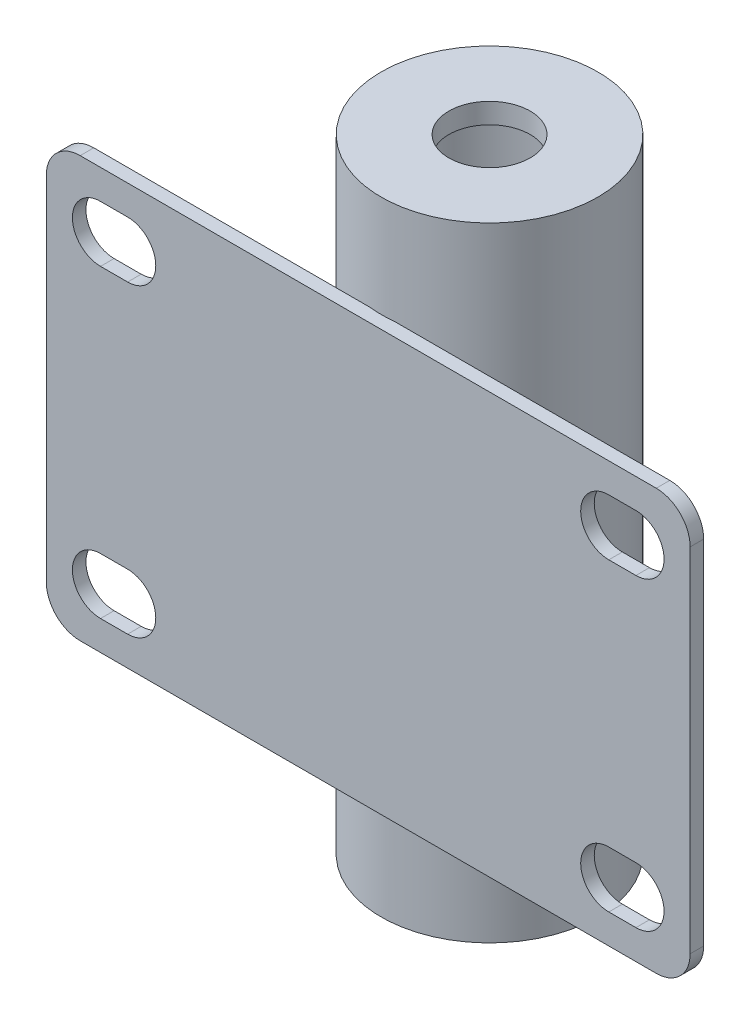
ISO-10303-21;
HEADER;
FILE_DESCRIPTION(('STEP AP214'),'2;1');
FILE_NAME('part.step','',(''),(''),'','','');
FILE_SCHEMA(('AUTOMOTIVE_DESIGN { 1 0 10303 214 1 1 1 1 }'));
ENDSEC;
DATA;
#1=APPLICATION_CONTEXT('core data for automotive mechanical design processes');
#2=APPLICATION_PROTOCOL_DEFINITION('international standard','automotive_design',2000,#1);
#3=PRODUCT_CONTEXT('',#1,'mechanical');
#4=PRODUCT('Part','Part','',(#3));
#5=PRODUCT_RELATED_PRODUCT_CATEGORY('part','',(#4));
#6=PRODUCT_DEFINITION_FORMATION('','',#4);
#7=PRODUCT_DEFINITION_CONTEXT('part definition',#1,'design');
#8=PRODUCT_DEFINITION('design','',#6,#7);
#9=PRODUCT_DEFINITION_SHAPE('','',#8);
#10=(LENGTH_UNIT() NAMED_UNIT(*) SI_UNIT(.MILLI.,.METRE.));
#11=(NAMED_UNIT(*) PLANE_ANGLE_UNIT() SI_UNIT($,.RADIAN.));
#12=(NAMED_UNIT(*) SI_UNIT($,.STERADIAN.) SOLID_ANGLE_UNIT());
#13=UNCERTAINTY_MEASURE_WITH_UNIT(LENGTH_MEASURE(1.E-05),#10,'distance_accuracy_value','');
#14=(GEOMETRIC_REPRESENTATION_CONTEXT(3) GLOBAL_UNCERTAINTY_ASSIGNED_CONTEXT((#13)) GLOBAL_UNIT_ASSIGNED_CONTEXT((#10,
#11,#12)) REPRESENTATION_CONTEXT('',''));
#15=CARTESIAN_POINT('',(0.,0.,0.));
#16=DIRECTION('',(0.,0.,1.));
#17=DIRECTION('',(1.,0.,0.));
#18=AXIS2_PLACEMENT_3D('',#15,#16,#17);
#19=CARTESIAN_POINT('',(0.,0.,0.));
#20=DIRECTION('',(0.,0.,1.));
#21=DIRECTION('',(1.,0.,0.));
#22=AXIS2_PLACEMENT_3D('',#19,#20,#21);
#23=PLANE('',#22);
#24=CARTESIAN_POINT('',(39.5,-22.5,0.));
#25=DIRECTION('',(0.,0.,1.));
#26=DIRECTION('',(1.,0.,0.));
#27=AXIS2_PLACEMENT_3D('',#24,#25,#26);
#28=CIRCLE('',#27,4.15000000000001);
#29=CARTESIAN_POINT('',(39.5,-26.65,0.));
#30=VERTEX_POINT('',#29);
#31=CARTESIAN_POINT('',(39.5,-18.35,0.));
#32=VERTEX_POINT('',#31);
#33=EDGE_CURVE('E241',#30,#32,#28,.T.);
#34=ORIENTED_EDGE('',*,*,#33,.T.);
#35=DIRECTION('',(-1.,0.,0.));
#36=VECTOR('',#35,1.);
#37=CARTESIAN_POINT('',(39.5,-18.35,0.));
#38=LINE('',#37,#36);
#39=CARTESIAN_POINT('',(35.5,-18.35,0.));
#40=VERTEX_POINT('',#39);
#41=EDGE_CURVE('E260',#32,#40,#38,.T.);
#42=ORIENTED_EDGE('',*,*,#41,.T.);
#43=CARTESIAN_POINT('',(35.5,-22.5,0.));
#44=DIRECTION('',(0.,0.,1.));
#45=DIRECTION('',(1.,0.,0.));
#46=AXIS2_PLACEMENT_3D('',#43,#44,#45);
#47=CIRCLE('',#46,4.15000000000001);
#48=CARTESIAN_POINT('',(35.5,-26.65,0.));
#49=VERTEX_POINT('',#48);
#50=EDGE_CURVE('E263',#40,#49,#47,.T.);
#51=ORIENTED_EDGE('',*,*,#50,.T.);
#52=DIRECTION('',(1.,0.,0.));
#53=VECTOR('',#52,1.);
#54=CARTESIAN_POINT('',(39.5,-26.65,0.));
#55=LINE('',#54,#53);
#56=EDGE_CURVE('E250',#49,#30,#55,.T.);
#57=ORIENTED_EDGE('',*,*,#56,.T.);
#58=EDGE_LOOP('',(#34,#42,#51,#57));
#59=FACE_BOUND('',#58,.T.);
#60=CARTESIAN_POINT('',(39.5,22.5,0.));
#61=DIRECTION('',(0.,0.,1.));
#62=DIRECTION('',(-1.,0.,0.));
#63=AXIS2_PLACEMENT_3D('',#60,#61,#62);
#64=CIRCLE('',#63,4.15000000000001);
#65=CARTESIAN_POINT('',(39.5,18.35,0.));
#66=VERTEX_POINT('',#65);
#67=CARTESIAN_POINT('',(39.5,26.65,0.));
#68=VERTEX_POINT('',#67);
#69=EDGE_CURVE('E308',#66,#68,#64,.T.);
#70=ORIENTED_EDGE('',*,*,#69,.T.);
#71=DIRECTION('',(-1.,0.,0.));
#72=VECTOR('',#71,1.);
#73=CARTESIAN_POINT('',(39.5,26.65,0.));
#74=LINE('',#73,#72);
#75=CARTESIAN_POINT('',(35.5,26.65,0.));
#76=VERTEX_POINT('',#75);
#77=EDGE_CURVE('E322',#68,#76,#74,.T.);
#78=ORIENTED_EDGE('',*,*,#77,.T.);
#79=CARTESIAN_POINT('',(35.5,22.5,0.));
#80=DIRECTION('',(0.,0.,1.));
#81=DIRECTION('',(-1.,0.,0.));
#82=AXIS2_PLACEMENT_3D('',#79,#80,#81);
#83=CIRCLE('',#82,4.15000000000001);
#84=CARTESIAN_POINT('',(35.5,18.35,0.));
#85=VERTEX_POINT('',#84);
#86=EDGE_CURVE('E325',#76,#85,#83,.T.);
#87=ORIENTED_EDGE('',*,*,#86,.T.);
#88=DIRECTION('',(1.,0.,0.));
#89=VECTOR('',#88,1.);
#90=CARTESIAN_POINT('',(39.5,18.35,0.));
#91=LINE('',#90,#89);
#92=EDGE_CURVE('E312',#85,#66,#91,.T.);
#93=ORIENTED_EDGE('',*,*,#92,.T.);
#94=EDGE_LOOP('',(#70,#78,#87,#93));
#95=FACE_BOUND('',#94,.T.);
#96=DIRECTION('',(0.,1.,0.));
#97=VECTOR('',#96,1.);
#98=CARTESIAN_POINT('',(47.5,-31.,0.));
#99=LINE('',#98,#97);
#100=CARTESIAN_POINT('',(47.5,-26.,0.));
#101=VERTEX_POINT('',#100);
#102=CARTESIAN_POINT('',(47.5,26.,0.));
#103=VERTEX_POINT('',#102);
#104=EDGE_CURVE('E384',#101,#103,#99,.T.);
#105=ORIENTED_EDGE('',*,*,#104,.F.);
#106=CARTESIAN_POINT('',(42.5,-26.,0.));
#107=DIRECTION('',(0.,0.,1.));
#108=DIRECTION('',(1.,0.,0.));
#109=AXIS2_PLACEMENT_3D('',#106,#107,#108);
#110=CIRCLE('',#109,5.);
#111=CARTESIAN_POINT('',(42.5,-31.,0.));
#112=VERTEX_POINT('',#111);
#113=EDGE_CURVE('E393',#101,#112,#110,.F.);
#114=ORIENTED_EDGE('',*,*,#113,.T.);
#115=DIRECTION('',(1.,0.,0.));
#116=VECTOR('',#115,1.);
#117=CARTESIAN_POINT('',(47.5,-31.,0.));
#118=LINE('',#117,#116);
#119=CARTESIAN_POINT('',(1.78605710994917,-31.,0.));
#120=VERTEX_POINT('',#119);
#121=EDGE_CURVE('E238',#120,#112,#118,.T.);
#122=ORIENTED_EDGE('',*,*,#121,.F.);
#123=DIRECTION('',(0.,1.,0.));
#124=VECTOR('',#123,1.);
#125=CARTESIAN_POINT('',(1.78605710994918,-46.,0.));
#126=LINE('',#125,#124);
#127=CARTESIAN_POINT('',(1.78605710994916,31.,0.));
#128=VERTEX_POINT('',#127);
#129=EDGE_CURVE('E228',#120,#128,#126,.T.);
#130=ORIENTED_EDGE('',*,*,#129,.T.);
#131=DIRECTION('',(-1.,0.,0.));
#132=VECTOR('',#131,1.);
#133=CARTESIAN_POINT('',(47.5,31.,0.));
#134=LINE('',#133,#132);
#135=CARTESIAN_POINT('',(42.5,31.,0.));
#136=VERTEX_POINT('',#135);
#137=EDGE_CURVE('E212',#136,#128,#134,.T.);
#138=ORIENTED_EDGE('',*,*,#137,.F.);
#139=CARTESIAN_POINT('',(42.5,26.,0.));
#140=DIRECTION('',(0.,0.,1.));
#141=DIRECTION('',(1.,0.,0.));
#142=AXIS2_PLACEMENT_3D('',#139,#140,#141);
#143=CIRCLE('',#142,5.);
#144=EDGE_CURVE('E391',#136,#103,#143,.F.);
#145=ORIENTED_EDGE('',*,*,#144,.T.);
#146=EDGE_LOOP('',(#105,#114,#122,#130,#138,#145));
#147=FACE_BOUND('',#146,.T.);
#148=ADVANCED_FACE('F37',(#59,#95,#147),#23,.F.);
#149=CARTESIAN_POINT('',(0.,0.,2.));
#150=DIRECTION('',(0.,0.,1.));
#151=DIRECTION('',(1.,0.,0.));
#152=AXIS2_PLACEMENT_3D('',#149,#150,#151);
#153=PLANE('',#152);
#154=DIRECTION('',(1.,0.,0.));
#155=VECTOR('',#154,1.);
#156=CARTESIAN_POINT('',(47.5,-31.,2.));
#157=LINE('',#156,#155);
#158=CARTESIAN_POINT('',(-42.5,-31.,2.));
#159=VERTEX_POINT('',#158);
#160=CARTESIAN_POINT('',(42.5,-31.,2.));
#161=VERTEX_POINT('',#160);
#162=EDGE_CURVE('E373',#159,#161,#157,.T.);
#163=ORIENTED_EDGE('',*,*,#162,.T.);
#164=CARTESIAN_POINT('',(42.5,-26.,2.));
#165=DIRECTION('',(0.,0.,1.));
#166=DIRECTION('',(1.,0.,0.));
#167=AXIS2_PLACEMENT_3D('',#164,#165,#166);
#168=CIRCLE('',#167,5.);
#169=CARTESIAN_POINT('',(47.5,-26.,2.));
#170=VERTEX_POINT('',#169);
#171=EDGE_CURVE('E406',#161,#170,#168,.T.);
#172=ORIENTED_EDGE('',*,*,#171,.T.);
#173=DIRECTION('',(0.,1.,0.));
#174=VECTOR('',#173,1.);
#175=CARTESIAN_POINT('',(47.5,-31.,2.));
#176=LINE('',#175,#174);
#177=CARTESIAN_POINT('',(47.5,26.,2.));
#178=VERTEX_POINT('',#177);
#179=EDGE_CURVE('E376',#170,#178,#176,.T.);
#180=ORIENTED_EDGE('',*,*,#179,.T.);
#181=CARTESIAN_POINT('',(42.5,26.,2.));
#182=DIRECTION('',(0.,0.,1.));
#183=DIRECTION('',(1.,0.,0.));
#184=AXIS2_PLACEMENT_3D('',#181,#182,#183);
#185=CIRCLE('',#184,5.);
#186=CARTESIAN_POINT('',(42.5,31.,2.));
#187=VERTEX_POINT('',#186);
#188=EDGE_CURVE('E400',#178,#187,#185,.T.);
#189=ORIENTED_EDGE('',*,*,#188,.T.);
#190=DIRECTION('',(-1.,0.,0.));
#191=VECTOR('',#190,1.);
#192=CARTESIAN_POINT('',(47.5,31.,2.));
#193=LINE('',#192,#191);
#194=CARTESIAN_POINT('',(-42.5,31.,2.));
#195=VERTEX_POINT('',#194);
#196=EDGE_CURVE('E233',#187,#195,#193,.T.);
#197=ORIENTED_EDGE('',*,*,#196,.T.);
#198=CARTESIAN_POINT('',(-42.5,26.,2.));
#199=DIRECTION('',(0.,0.,1.));
#200=DIRECTION('',(1.,0.,0.));
#201=AXIS2_PLACEMENT_3D('',#198,#199,#200);
#202=CIRCLE('',#201,5.);
#203=CARTESIAN_POINT('',(-47.5,26.,2.));
#204=VERTEX_POINT('',#203);
#205=EDGE_CURVE('E402',#195,#204,#202,.T.);
#206=ORIENTED_EDGE('',*,*,#205,.T.);
#207=DIRECTION('',(0.,-1.,0.));
#208=VECTOR('',#207,1.);
#209=CARTESIAN_POINT('',(-47.5,-31.,2.));
#210=LINE('',#209,#208);
#211=CARTESIAN_POINT('',(-47.5,-26.,2.));
#212=VERTEX_POINT('',#211);
#213=EDGE_CURVE('E222',#204,#212,#210,.T.);
#214=ORIENTED_EDGE('',*,*,#213,.T.);
#215=CARTESIAN_POINT('',(-42.5,-26.,2.));
#216=DIRECTION('',(0.,0.,1.));
#217=DIRECTION('',(1.,0.,0.));
#218=AXIS2_PLACEMENT_3D('',#215,#216,#217);
#219=CIRCLE('',#218,5.);
#220=EDGE_CURVE('E404',#212,#159,#219,.T.);
#221=ORIENTED_EDGE('',*,*,#220,.T.);
#222=EDGE_LOOP('',(#163,#172,#180,#189,#197,#206,#214,#221));
#223=FACE_BOUND('',#222,.T.);
#224=DIRECTION('',(1.,0.,0.));
#225=VECTOR('',#224,1.);
#226=CARTESIAN_POINT('',(-39.5,18.35,2.));
#227=LINE('',#226,#225);
#228=CARTESIAN_POINT('',(-39.5,18.35,2.));
#229=VERTEX_POINT('',#228);
#230=CARTESIAN_POINT('',(-35.5,18.35,2.));
#231=VERTEX_POINT('',#230);
#232=EDGE_CURVE('E342',#229,#231,#227,.T.);
#233=ORIENTED_EDGE('',*,*,#232,.F.);
#234=CARTESIAN_POINT('',(-39.5,22.5,2.));
#235=DIRECTION('',(0.,0.,1.));
#236=DIRECTION('',(1.,0.,0.));
#237=AXIS2_PLACEMENT_3D('',#234,#235,#236);
#238=CIRCLE('',#237,4.15000000000001);
#239=CARTESIAN_POINT('',(-39.5,26.65,2.));
#240=VERTEX_POINT('',#239);
#241=EDGE_CURVE('E340',#240,#229,#238,.T.);
#242=ORIENTED_EDGE('',*,*,#241,.F.);
#243=DIRECTION('',(-1.,0.,0.));
#244=VECTOR('',#243,1.);
#245=CARTESIAN_POINT('',(-39.5,26.65,2.));
#246=LINE('',#245,#244);
#247=CARTESIAN_POINT('',(-35.5,26.65,2.));
#248=VERTEX_POINT('',#247);
#249=EDGE_CURVE('E348',#248,#240,#246,.T.);
#250=ORIENTED_EDGE('',*,*,#249,.F.);
#251=CARTESIAN_POINT('',(-35.5,22.5,2.));
#252=DIRECTION('',(0.,0.,1.));
#253=DIRECTION('',(1.,0.,0.));
#254=AXIS2_PLACEMENT_3D('',#251,#252,#253);
#255=CIRCLE('',#254,4.15000000000001);
#256=EDGE_CURVE('E345',#231,#248,#255,.T.);
#257=ORIENTED_EDGE('',*,*,#256,.F.);
#258=EDGE_LOOP('',(#233,#242,#250,#257));
#259=FACE_BOUND('',#258,.T.);
#260=DIRECTION('',(-1.,0.,0.));
#261=VECTOR('',#260,1.);
#262=CARTESIAN_POINT('',(39.5,26.65,2.));
#263=LINE('',#262,#261);
#264=CARTESIAN_POINT('',(39.5,26.65,2.));
#265=VERTEX_POINT('',#264);
#266=CARTESIAN_POINT('',(35.5,26.65,2.));
#267=VERTEX_POINT('',#266);
#268=EDGE_CURVE('E311',#265,#267,#263,.T.);
#269=ORIENTED_EDGE('',*,*,#268,.F.);
#270=CARTESIAN_POINT('',(39.5,22.5,2.));
#271=DIRECTION('',(0.,0.,1.));
#272=DIRECTION('',(-1.,0.,0.));
#273=AXIS2_PLACEMENT_3D('',#270,#271,#272);
#274=CIRCLE('',#273,4.15000000000001);
#275=CARTESIAN_POINT('',(39.5,18.35,2.));
#276=VERTEX_POINT('',#275);
#277=EDGE_CURVE('E309',#276,#265,#274,.T.);
#278=ORIENTED_EDGE('',*,*,#277,.F.);
#279=DIRECTION('',(1.,0.,0.));
#280=VECTOR('',#279,1.);
#281=CARTESIAN_POINT('',(39.5,18.35,2.));
#282=LINE('',#281,#280);
#283=CARTESIAN_POINT('',(35.5,18.35,2.));
#284=VERTEX_POINT('',#283);
#285=EDGE_CURVE('E317',#284,#276,#282,.T.);
#286=ORIENTED_EDGE('',*,*,#285,.F.);
#287=CARTESIAN_POINT('',(35.5,22.5,2.));
#288=DIRECTION('',(0.,0.,1.));
#289=DIRECTION('',(-1.,0.,0.));
#290=AXIS2_PLACEMENT_3D('',#287,#288,#289);
#291=CIRCLE('',#290,4.15000000000001);
#292=EDGE_CURVE('E314',#267,#284,#291,.T.);
#293=ORIENTED_EDGE('',*,*,#292,.F.);
#294=EDGE_LOOP('',(#269,#278,#286,#293));
#295=FACE_BOUND('',#294,.T.);
#296=DIRECTION('',(1.,0.,0.));
#297=VECTOR('',#296,1.);
#298=CARTESIAN_POINT('',(-39.5,-26.65,2.));
#299=LINE('',#298,#297);
#300=CARTESIAN_POINT('',(-39.5,-26.65,2.));
#301=VERTEX_POINT('',#300);
#302=CARTESIAN_POINT('',(-35.5,-26.65,2.));
#303=VERTEX_POINT('',#302);
#304=EDGE_CURVE('E280',#301,#303,#299,.T.);
#305=ORIENTED_EDGE('',*,*,#304,.F.);
#306=CARTESIAN_POINT('',(-39.5,-22.5,2.));
#307=DIRECTION('',(0.,0.,1.));
#308=DIRECTION('',(-1.,0.,0.));
#309=AXIS2_PLACEMENT_3D('',#306,#307,#308);
#310=CIRCLE('',#309,4.15000000000001);
#311=CARTESIAN_POINT('',(-39.5,-18.35,2.));
#312=VERTEX_POINT('',#311);
#313=EDGE_CURVE('E278',#312,#301,#310,.T.);
#314=ORIENTED_EDGE('',*,*,#313,.F.);
#315=DIRECTION('',(-1.,0.,0.));
#316=VECTOR('',#315,1.);
#317=CARTESIAN_POINT('',(-39.5,-18.35,2.));
#318=LINE('',#317,#316);
#319=CARTESIAN_POINT('',(-35.5,-18.35,2.));
#320=VERTEX_POINT('',#319);
#321=EDGE_CURVE('E286',#320,#312,#318,.T.);
#322=ORIENTED_EDGE('',*,*,#321,.F.);
#323=CARTESIAN_POINT('',(-35.5,-22.5,2.));
#324=DIRECTION('',(0.,0.,1.));
#325=DIRECTION('',(-1.,0.,0.));
#326=AXIS2_PLACEMENT_3D('',#323,#324,#325);
#327=CIRCLE('',#326,4.15000000000001);
#328=EDGE_CURVE('E283',#303,#320,#327,.T.);
#329=ORIENTED_EDGE('',*,*,#328,.F.);
#330=EDGE_LOOP('',(#305,#314,#322,#329));
#331=FACE_BOUND('',#330,.T.);
#332=DIRECTION('',(-1.,0.,0.));
#333=VECTOR('',#332,1.);
#334=CARTESIAN_POINT('',(39.5,-18.35,2.));
#335=LINE('',#334,#333);
#336=CARTESIAN_POINT('',(39.5,-18.35,2.));
#337=VERTEX_POINT('',#336);
#338=CARTESIAN_POINT('',(35.5,-18.35,2.));
#339=VERTEX_POINT('',#338);
#340=EDGE_CURVE('E249',#337,#339,#335,.T.);
#341=ORIENTED_EDGE('',*,*,#340,.F.);
#342=CARTESIAN_POINT('',(39.5,-22.5,2.));
#343=DIRECTION('',(0.,0.,1.));
#344=DIRECTION('',(1.,0.,0.));
#345=AXIS2_PLACEMENT_3D('',#342,#343,#344);
#346=CIRCLE('',#345,4.15000000000001);
#347=CARTESIAN_POINT('',(39.5,-26.65,2.));
#348=VERTEX_POINT('',#347);
#349=EDGE_CURVE('E247',#348,#337,#346,.T.);
#350=ORIENTED_EDGE('',*,*,#349,.F.);
#351=DIRECTION('',(1.,0.,0.));
#352=VECTOR('',#351,1.);
#353=CARTESIAN_POINT('',(39.5,-26.65,2.));
#354=LINE('',#353,#352);
#355=CARTESIAN_POINT('',(35.5,-26.65,2.));
#356=VERTEX_POINT('',#355);
#357=EDGE_CURVE('E255',#356,#348,#354,.T.);
#358=ORIENTED_EDGE('',*,*,#357,.F.);
#359=CARTESIAN_POINT('',(35.5,-22.5,2.));
#360=DIRECTION('',(0.,0.,1.));
#361=DIRECTION('',(1.,0.,0.));
#362=AXIS2_PLACEMENT_3D('',#359,#360,#361);
#363=CIRCLE('',#362,4.15000000000001);
#364=EDGE_CURVE('E252',#339,#356,#363,.T.);
#365=ORIENTED_EDGE('',*,*,#364,.F.);
#366=EDGE_LOOP('',(#341,#350,#358,#365));
#367=FACE_BOUND('',#366,.T.);
#368=ADVANCED_FACE('F420',(#223,#259,#295,#331,#367),#153,.T.);
#369=CARTESIAN_POINT('',(-39.5,-22.5,0.));
#370=DIRECTION('',(0.,0.,1.));
#371=DIRECTION('',(-1.,0.,0.));
#372=AXIS2_PLACEMENT_3D('',#369,#370,#371);
#373=CIRCLE('',#372,4.15000000000001);
#374=CARTESIAN_POINT('',(-39.5,-18.35,0.));
#375=VERTEX_POINT('',#374);
#376=CARTESIAN_POINT('',(-39.5,-26.65,0.));
#377=VERTEX_POINT('',#376);
#378=EDGE_CURVE('E277',#375,#377,#373,.T.);
#379=ORIENTED_EDGE('',*,*,#378,.T.);
#380=DIRECTION('',(1.,0.,0.));
#381=VECTOR('',#380,1.);
#382=CARTESIAN_POINT('',(-39.5,-26.65,0.));
#383=LINE('',#382,#381);
#384=CARTESIAN_POINT('',(-35.5,-26.65,0.));
#385=VERTEX_POINT('',#384);
#386=EDGE_CURVE('E291',#377,#385,#383,.T.);
#387=ORIENTED_EDGE('',*,*,#386,.T.);
#388=CARTESIAN_POINT('',(-35.5,-22.5,0.));
#389=DIRECTION('',(0.,0.,1.));
#390=DIRECTION('',(-1.,0.,0.));
#391=AXIS2_PLACEMENT_3D('',#388,#389,#390);
#392=CIRCLE('',#391,4.15000000000001);
#393=CARTESIAN_POINT('',(-35.5,-18.35,0.));
#394=VERTEX_POINT('',#393);
#395=EDGE_CURVE('E294',#385,#394,#392,.T.);
#396=ORIENTED_EDGE('',*,*,#395,.T.);
#397=DIRECTION('',(-1.,0.,0.));
#398=VECTOR('',#397,1.);
#399=CARTESIAN_POINT('',(-39.5,-18.35,0.));
#400=LINE('',#399,#398);
#401=EDGE_CURVE('E281',#394,#375,#400,.T.);
#402=ORIENTED_EDGE('',*,*,#401,.T.);
#403=EDGE_LOOP('',(#379,#387,#396,#402));
#404=FACE_BOUND('',#403,.T.);
#405=CARTESIAN_POINT('',(-39.5,22.5,0.));
#406=DIRECTION('',(0.,0.,1.));
#407=DIRECTION('',(1.,0.,0.));
#408=AXIS2_PLACEMENT_3D('',#405,#406,#407);
#409=CIRCLE('',#408,4.15000000000001);
#410=CARTESIAN_POINT('',(-39.5,26.65,0.));
#411=VERTEX_POINT('',#410);
#412=CARTESIAN_POINT('',(-39.5,18.35,0.));
#413=VERTEX_POINT('',#412);
#414=EDGE_CURVE('E339',#411,#413,#409,.T.);
#415=ORIENTED_EDGE('',*,*,#414,.T.);
#416=DIRECTION('',(1.,0.,0.));
#417=VECTOR('',#416,1.);
#418=CARTESIAN_POINT('',(-39.5,18.35,0.));
#419=LINE('',#418,#417);
#420=CARTESIAN_POINT('',(-35.5,18.35,0.));
#421=VERTEX_POINT('',#420);
#422=EDGE_CURVE('E353',#413,#421,#419,.T.);
#423=ORIENTED_EDGE('',*,*,#422,.T.);
#424=CARTESIAN_POINT('',(-35.5,22.5,0.));
#425=DIRECTION('',(0.,0.,1.));
#426=DIRECTION('',(1.,0.,0.));
#427=AXIS2_PLACEMENT_3D('',#424,#425,#426);
#428=CIRCLE('',#427,4.15000000000001);
#429=CARTESIAN_POINT('',(-35.5,26.65,0.));
#430=VERTEX_POINT('',#429);
#431=EDGE_CURVE('E356',#421,#430,#428,.T.);
#432=ORIENTED_EDGE('',*,*,#431,.T.);
#433=DIRECTION('',(-1.,0.,0.));
#434=VECTOR('',#433,1.);
#435=CARTESIAN_POINT('',(-39.5,26.65,0.));
#436=LINE('',#435,#434);
#437=EDGE_CURVE('E343',#430,#411,#436,.T.);
#438=ORIENTED_EDGE('',*,*,#437,.T.);
#439=EDGE_LOOP('',(#415,#423,#432,#438));
#440=FACE_BOUND('',#439,.T.);
#441=CARTESIAN_POINT('',(-42.5,-31.,0.));
#442=VERTEX_POINT('',#441);
#443=CARTESIAN_POINT('',(-1.78605710994916,-31.,0.));
#444=VERTEX_POINT('',#443);
#445=EDGE_CURVE('E382',#442,#444,#118,.T.);
#446=ORIENTED_EDGE('',*,*,#445,.F.);
#447=CARTESIAN_POINT('',(-42.5,-26.,0.));
#448=DIRECTION('',(0.,0.,1.));
#449=DIRECTION('',(1.,0.,0.));
#450=AXIS2_PLACEMENT_3D('',#447,#448,#449);
#451=CIRCLE('',#450,5.);
#452=CARTESIAN_POINT('',(-47.5,-26.,0.));
#453=VERTEX_POINT('',#452);
#454=EDGE_CURVE('E52',#442,#453,#451,.F.);
#455=ORIENTED_EDGE('',*,*,#454,.T.);
#456=DIRECTION('',(0.,-1.,0.));
#457=VECTOR('',#456,1.);
#458=CARTESIAN_POINT('',(-47.5,-31.,0.));
#459=LINE('',#458,#457);
#460=CARTESIAN_POINT('',(-47.5,26.,0.));
#461=VERTEX_POINT('',#460);
#462=EDGE_CURVE('E370',#461,#453,#459,.T.);
#463=ORIENTED_EDGE('',*,*,#462,.F.);
#464=CARTESIAN_POINT('',(-42.5,26.,0.));
#465=DIRECTION('',(0.,0.,1.));
#466=DIRECTION('',(1.,0.,0.));
#467=AXIS2_PLACEMENT_3D('',#464,#465,#466);
#468=CIRCLE('',#467,5.);
#469=CARTESIAN_POINT('',(-42.5,31.,0.));
#470=VERTEX_POINT('',#469);
#471=EDGE_CURVE('E60',#461,#470,#468,.F.);
#472=ORIENTED_EDGE('',*,*,#471,.T.);
#473=CARTESIAN_POINT('',(-1.78605710994917,31.,0.));
#474=VERTEX_POINT('',#473);
#475=EDGE_CURVE('E223',#474,#470,#134,.T.);
#476=ORIENTED_EDGE('',*,*,#475,.F.);
#477=DIRECTION('',(0.,1.,0.));
#478=VECTOR('',#477,1.);
#479=CARTESIAN_POINT('',(-1.78605710994916,-46.,0.));
#480=LINE('',#479,#478);
#481=EDGE_CURVE('E231',#474,#444,#480,.F.);
#482=ORIENTED_EDGE('',*,*,#481,.T.);
#483=EDGE_LOOP('',(#446,#455,#463,#472,#476,#482));
#484=FACE_BOUND('',#483,.T.);
#485=ADVANCED_FACE('F428',(#404,#440,#484),#23,.F.);
#486=CARTESIAN_POINT('',(-47.5,-31.,2.));
#487=DIRECTION('',(1.,0.,0.));
#488=DIRECTION('',(0.,0.,-1.));
#489=AXIS2_PLACEMENT_3D('',#486,#487,#488);
#490=PLANE('',#489);
#491=ORIENTED_EDGE('',*,*,#462,.T.);
#492=DIRECTION('',(0.,0.,-1.));
#493=VECTOR('',#492,1.);
#494=CARTESIAN_POINT('',(-47.5,-26.,2.));
#495=LINE('',#494,#493);
#496=EDGE_CURVE('E412',#453,#212,#495,.F.);
#497=ORIENTED_EDGE('',*,*,#496,.T.);
#498=ORIENTED_EDGE('',*,*,#213,.F.);
#499=DIRECTION('',(0.,0.,-1.));
#500=VECTOR('',#499,1.);
#501=CARTESIAN_POINT('',(-47.5,26.,2.));
#502=LINE('',#501,#500);
#503=EDGE_CURVE('E410',#204,#461,#502,.T.);
#504=ORIENTED_EDGE('',*,*,#503,.T.);
#505=EDGE_LOOP('',(#491,#497,#498,#504));
#506=FACE_BOUND('',#505,.T.);
#507=ADVANCED_FACE('F416',(#506),#490,.F.);
#508=CARTESIAN_POINT('',(47.5,-31.,2.));
#509=DIRECTION('',(0.,1.,0.));
#510=DIRECTION('',(-1.,0.,0.));
#511=AXIS2_PLACEMENT_3D('',#508,#509,#510);
#512=PLANE('',#511);
#513=ORIENTED_EDGE('',*,*,#121,.T.);
#514=DIRECTION('',(0.,0.,-1.));
#515=VECTOR('',#514,1.);
#516=CARTESIAN_POINT('',(42.5,-31.,2.));
#517=LINE('',#516,#515);
#518=EDGE_CURVE('E398',#112,#161,#517,.F.);
#519=ORIENTED_EDGE('',*,*,#518,.T.);
#520=ORIENTED_EDGE('',*,*,#162,.F.);
#521=DIRECTION('',(0.,0.,-1.));
#522=VECTOR('',#521,1.);
#523=CARTESIAN_POINT('',(-42.5,-31.,2.));
#524=LINE('',#523,#522);
#525=EDGE_CURVE('E395',#159,#442,#524,.T.);
#526=ORIENTED_EDGE('',*,*,#525,.T.);
#527=ORIENTED_EDGE('',*,*,#445,.T.);
#528=CARTESIAN_POINT('',(0.,-31.,-15.9));
#529=DIRECTION('',(0.,1.,0.));
#530=DIRECTION('',(-1.,0.,0.));
#531=AXIS2_PLACEMENT_3D('',#528,#529,#530);
#532=CIRCLE('',#531,16.);
#533=EDGE_CURVE('E239',#444,#120,#532,.T.);
#534=ORIENTED_EDGE('',*,*,#533,.T.);
#535=EDGE_LOOP('',(#513,#519,#520,#526,#527,#534));
#536=FACE_BOUND('',#535,.T.);
#537=ADVANCED_FACE('F427',(#536),#512,.F.);
#538=CARTESIAN_POINT('',(47.5,-31.,2.));
#539=DIRECTION('',(-1.,0.,0.));
#540=DIRECTION('',(0.,0.,1.));
#541=AXIS2_PLACEMENT_3D('',#538,#539,#540);
#542=PLANE('',#541);
#543=ORIENTED_EDGE('',*,*,#179,.F.);
#544=DIRECTION('',(0.,0.,-1.));
#545=VECTOR('',#544,1.);
#546=CARTESIAN_POINT('',(47.5,-26.,2.));
#547=LINE('',#546,#545);
#548=EDGE_CURVE('E388',#170,#101,#547,.T.);
#549=ORIENTED_EDGE('',*,*,#548,.T.);
#550=ORIENTED_EDGE('',*,*,#104,.T.);
#551=DIRECTION('',(0.,0.,-1.));
#552=VECTOR('',#551,1.);
#553=CARTESIAN_POINT('',(47.5,26.,2.));
#554=LINE('',#553,#552);
#555=EDGE_CURVE('E232',#103,#178,#554,.F.);
#556=ORIENTED_EDGE('',*,*,#555,.T.);
#557=EDGE_LOOP('',(#543,#549,#550,#556));
#558=FACE_BOUND('',#557,.T.);
#559=ADVANCED_FACE('F488',(#558),#542,.F.);
#560=CARTESIAN_POINT('',(47.5,31.,2.));
#561=DIRECTION('',(0.,-1.,0.));
#562=DIRECTION('',(1.,0.,0.));
#563=AXIS2_PLACEMENT_3D('',#560,#561,#562);
#564=PLANE('',#563);
#565=ORIENTED_EDGE('',*,*,#475,.T.);
#566=DIRECTION('',(0.,0.,-1.));
#567=VECTOR('',#566,1.);
#568=CARTESIAN_POINT('',(-42.5,31.,2.));
#569=LINE('',#568,#567);
#570=EDGE_CURVE('E11',#470,#195,#569,.F.);
#571=ORIENTED_EDGE('',*,*,#570,.T.);
#572=ORIENTED_EDGE('',*,*,#196,.F.);
#573=DIRECTION('',(0.,0.,-1.));
#574=VECTOR('',#573,1.);
#575=CARTESIAN_POINT('',(42.5,31.,2.));
#576=LINE('',#575,#574);
#577=EDGE_CURVE('E45',#187,#136,#576,.T.);
#578=ORIENTED_EDGE('',*,*,#577,.T.);
#579=ORIENTED_EDGE('',*,*,#137,.T.);
#580=CARTESIAN_POINT('',(0.,31.,-15.9));
#581=DIRECTION('',(0.,-1.,0.));
#582=DIRECTION('',(1.,0.,0.));
#583=AXIS2_PLACEMENT_3D('',#580,#581,#582);
#584=CIRCLE('',#583,16.);
#585=EDGE_CURVE('E216',#128,#474,#584,.T.);
#586=ORIENTED_EDGE('',*,*,#585,.T.);
#587=EDGE_LOOP('',(#565,#571,#572,#578,#579,#586));
#588=FACE_BOUND('',#587,.T.);
#589=ADVANCED_FACE('F215',(#588),#564,.F.);
#590=CARTESIAN_POINT('',(-39.5,22.5,2.));
#591=DIRECTION('',(0.,0.,-1.));
#592=DIRECTION('',(-1.,0.,0.));
#593=AXIS2_PLACEMENT_3D('',#590,#591,#592);
#594=CYLINDRICAL_SURFACE('',#593,4.15000000000001);
#595=ORIENTED_EDGE('',*,*,#414,.F.);
#596=DIRECTION('',(0.,0.,-1.));
#597=VECTOR('',#596,1.);
#598=CARTESIAN_POINT('',(-39.5,26.65,2.));
#599=LINE('',#598,#597);
#600=EDGE_CURVE('E350',#240,#411,#599,.T.);
#601=ORIENTED_EDGE('',*,*,#600,.F.);
#602=ORIENTED_EDGE('',*,*,#241,.T.);
#603=DIRECTION('',(0.,0.,-1.));
#604=VECTOR('',#603,1.);
#605=CARTESIAN_POINT('',(-39.5,18.35,2.));
#606=LINE('',#605,#604);
#607=EDGE_CURVE('E367',#229,#413,#606,.T.);
#608=ORIENTED_EDGE('',*,*,#607,.T.);
#609=EDGE_LOOP('',(#595,#601,#602,#608));
#610=FACE_BOUND('',#609,.T.);
#611=ADVANCED_FACE('F458',(#610),#594,.F.);
#612=CARTESIAN_POINT('',(-39.5,18.35,2.));
#613=DIRECTION('',(0.,1.,0.));
#614=DIRECTION('',(0.,0.,1.));
#615=AXIS2_PLACEMENT_3D('',#612,#613,#614);
#616=PLANE('',#615);
#617=ORIENTED_EDGE('',*,*,#422,.F.);
#618=ORIENTED_EDGE('',*,*,#607,.F.);
#619=ORIENTED_EDGE('',*,*,#232,.T.);
#620=DIRECTION('',(0.,0.,-1.));
#621=VECTOR('',#620,1.);
#622=CARTESIAN_POINT('',(-35.5,18.35,2.));
#623=LINE('',#622,#621);
#624=EDGE_CURVE('E365',#231,#421,#623,.T.);
#625=ORIENTED_EDGE('',*,*,#624,.T.);
#626=EDGE_LOOP('',(#617,#618,#619,#625));
#627=FACE_BOUND('',#626,.T.);
#628=ADVANCED_FACE('F468',(#627),#616,.T.);
#629=CARTESIAN_POINT('',(-35.5,22.5,2.));
#630=DIRECTION('',(0.,0.,-1.));
#631=DIRECTION('',(-1.,0.,0.));
#632=AXIS2_PLACEMENT_3D('',#629,#630,#631);
#633=CYLINDRICAL_SURFACE('',#632,4.15000000000001);
#634=ORIENTED_EDGE('',*,*,#431,.F.);
#635=ORIENTED_EDGE('',*,*,#624,.F.);
#636=ORIENTED_EDGE('',*,*,#256,.T.);
#637=DIRECTION('',(0.,0.,-1.));
#638=VECTOR('',#637,1.);
#639=CARTESIAN_POINT('',(-35.5,26.65,2.));
#640=LINE('',#639,#638);
#641=EDGE_CURVE('E363',#248,#430,#640,.T.);
#642=ORIENTED_EDGE('',*,*,#641,.T.);
#643=EDGE_LOOP('',(#634,#635,#636,#642));
#644=FACE_BOUND('',#643,.T.);
#645=ADVANCED_FACE('F472',(#644),#633,.F.);
#646=CARTESIAN_POINT('',(-39.5,26.65,2.));
#647=DIRECTION('',(0.,-1.,0.));
#648=DIRECTION('',(0.,0.,-1.));
#649=AXIS2_PLACEMENT_3D('',#646,#647,#648);
#650=PLANE('',#649);
#651=ORIENTED_EDGE('',*,*,#437,.F.);
#652=ORIENTED_EDGE('',*,*,#641,.F.);
#653=ORIENTED_EDGE('',*,*,#249,.T.);
#654=ORIENTED_EDGE('',*,*,#600,.T.);
#655=EDGE_LOOP('',(#651,#652,#653,#654));
#656=FACE_BOUND('',#655,.T.);
#657=ADVANCED_FACE('F462',(#656),#650,.T.);
#658=CARTESIAN_POINT('',(39.5,22.5,2.));
#659=DIRECTION('',(0.,0.,-1.));
#660=DIRECTION('',(-1.,0.,0.));
#661=AXIS2_PLACEMENT_3D('',#658,#659,#660);
#662=CYLINDRICAL_SURFACE('',#661,4.15000000000001);
#663=ORIENTED_EDGE('',*,*,#69,.F.);
#664=DIRECTION('',(0.,0.,-1.));
#665=VECTOR('',#664,1.);
#666=CARTESIAN_POINT('',(39.5,18.35,2.));
#667=LINE('',#666,#665);
#668=EDGE_CURVE('E319',#276,#66,#667,.T.);
#669=ORIENTED_EDGE('',*,*,#668,.F.);
#670=ORIENTED_EDGE('',*,*,#277,.T.);
#671=DIRECTION('',(0.,0.,-1.));
#672=VECTOR('',#671,1.);
#673=CARTESIAN_POINT('',(39.5,26.65,2.));
#674=LINE('',#673,#672);
#675=EDGE_CURVE('E336',#265,#68,#674,.T.);
#676=ORIENTED_EDGE('',*,*,#675,.T.);
#677=EDGE_LOOP('',(#663,#669,#670,#676));
#678=FACE_BOUND('',#677,.T.);
#679=ADVANCED_FACE('F479',(#678),#662,.F.);
#680=CARTESIAN_POINT('',(39.5,26.65,2.));
#681=DIRECTION('',(0.,-1.,0.));
#682=DIRECTION('',(0.,0.,-1.));
#683=AXIS2_PLACEMENT_3D('',#680,#681,#682);
#684=PLANE('',#683);
#685=ORIENTED_EDGE('',*,*,#77,.F.);
#686=ORIENTED_EDGE('',*,*,#675,.F.);
#687=ORIENTED_EDGE('',*,*,#268,.T.);
#688=DIRECTION('',(0.,0.,-1.));
#689=VECTOR('',#688,1.);
#690=CARTESIAN_POINT('',(35.5,26.65,2.));
#691=LINE('',#690,#689);
#692=EDGE_CURVE('E334',#267,#76,#691,.T.);
#693=ORIENTED_EDGE('',*,*,#692,.T.);
#694=EDGE_LOOP('',(#685,#686,#687,#693));
#695=FACE_BOUND('',#694,.T.);
#696=ADVANCED_FACE('F564',(#695),#684,.T.);
#697=CARTESIAN_POINT('',(35.5,22.5,2.));
#698=DIRECTION('',(0.,0.,-1.));
#699=DIRECTION('',(-1.,0.,0.));
#700=AXIS2_PLACEMENT_3D('',#697,#698,#699);
#701=CYLINDRICAL_SURFACE('',#700,4.15000000000001);
#702=ORIENTED_EDGE('',*,*,#86,.F.);
#703=ORIENTED_EDGE('',*,*,#692,.F.);
#704=ORIENTED_EDGE('',*,*,#292,.T.);
#705=DIRECTION('',(0.,0.,-1.));
#706=VECTOR('',#705,1.);
#707=CARTESIAN_POINT('',(35.5,18.35,2.));
#708=LINE('',#707,#706);
#709=EDGE_CURVE('E332',#284,#85,#708,.T.);
#710=ORIENTED_EDGE('',*,*,#709,.T.);
#711=EDGE_LOOP('',(#702,#703,#704,#710));
#712=FACE_BOUND('',#711,.T.);
#713=ADVANCED_FACE('F560',(#712),#701,.F.);
#714=CARTESIAN_POINT('',(39.5,18.35,2.));
#715=DIRECTION('',(0.,1.,0.));
#716=DIRECTION('',(0.,0.,1.));
#717=AXIS2_PLACEMENT_3D('',#714,#715,#716);
#718=PLANE('',#717);
#719=ORIENTED_EDGE('',*,*,#92,.F.);
#720=ORIENTED_EDGE('',*,*,#709,.F.);
#721=ORIENTED_EDGE('',*,*,#285,.T.);
#722=ORIENTED_EDGE('',*,*,#668,.T.);
#723=EDGE_LOOP('',(#719,#720,#721,#722));
#724=FACE_BOUND('',#723,.T.);
#725=ADVANCED_FACE('F556',(#724),#718,.T.);
#726=CARTESIAN_POINT('',(-39.5,-22.5,2.));
#727=DIRECTION('',(0.,0.,-1.));
#728=DIRECTION('',(-1.,0.,0.));
#729=AXIS2_PLACEMENT_3D('',#726,#727,#728);
#730=CYLINDRICAL_SURFACE('',#729,4.15000000000001);
#731=ORIENTED_EDGE('',*,*,#378,.F.);
#732=DIRECTION('',(0.,0.,-1.));
#733=VECTOR('',#732,1.);
#734=CARTESIAN_POINT('',(-39.5,-18.35,2.));
#735=LINE('',#734,#733);
#736=EDGE_CURVE('E288',#312,#375,#735,.T.);
#737=ORIENTED_EDGE('',*,*,#736,.F.);
#738=ORIENTED_EDGE('',*,*,#313,.T.);
#739=DIRECTION('',(0.,0.,-1.));
#740=VECTOR('',#739,1.);
#741=CARTESIAN_POINT('',(-39.5,-26.65,2.));
#742=LINE('',#741,#740);
#743=EDGE_CURVE('E305',#301,#377,#742,.T.);
#744=ORIENTED_EDGE('',*,*,#743,.T.);
#745=EDGE_LOOP('',(#731,#737,#738,#744));
#746=FACE_BOUND('',#745,.T.);
#747=ADVANCED_FACE('F552',(#746),#730,.F.);
#748=CARTESIAN_POINT('',(-39.5,-26.65,2.));
#749=DIRECTION('',(0.,1.,0.));
#750=DIRECTION('',(0.,0.,1.));
#751=AXIS2_PLACEMENT_3D('',#748,#749,#750);
#752=PLANE('',#751);
#753=ORIENTED_EDGE('',*,*,#386,.F.);
#754=ORIENTED_EDGE('',*,*,#743,.F.);
#755=ORIENTED_EDGE('',*,*,#304,.T.);
#756=DIRECTION('',(0.,0.,-1.));
#757=VECTOR('',#756,1.);
#758=CARTESIAN_POINT('',(-35.5,-26.65,2.));
#759=LINE('',#758,#757);
#760=EDGE_CURVE('E303',#303,#385,#759,.T.);
#761=ORIENTED_EDGE('',*,*,#760,.T.);
#762=EDGE_LOOP('',(#753,#754,#755,#761));
#763=FACE_BOUND('',#762,.T.);
#764=ADVANCED_FACE('F548',(#763),#752,.T.);
#765=CARTESIAN_POINT('',(-35.5,-22.5,2.));
#766=DIRECTION('',(0.,0.,-1.));
#767=DIRECTION('',(-1.,0.,0.));
#768=AXIS2_PLACEMENT_3D('',#765,#766,#767);
#769=CYLINDRICAL_SURFACE('',#768,4.15000000000001);
#770=ORIENTED_EDGE('',*,*,#395,.F.);
#771=ORIENTED_EDGE('',*,*,#760,.F.);
#772=ORIENTED_EDGE('',*,*,#328,.T.);
#773=DIRECTION('',(0.,0.,-1.));
#774=VECTOR('',#773,1.);
#775=CARTESIAN_POINT('',(-35.5,-18.35,2.));
#776=LINE('',#775,#774);
#777=EDGE_CURVE('E301',#320,#394,#776,.T.);
#778=ORIENTED_EDGE('',*,*,#777,.T.);
#779=EDGE_LOOP('',(#770,#771,#772,#778));
#780=FACE_BOUND('',#779,.T.);
#781=ADVANCED_FACE('F544',(#780),#769,.F.);
#782=CARTESIAN_POINT('',(-39.5,-18.35,2.));
#783=DIRECTION('',(0.,-1.,0.));
#784=DIRECTION('',(0.,0.,-1.));
#785=AXIS2_PLACEMENT_3D('',#782,#783,#784);
#786=PLANE('',#785);
#787=ORIENTED_EDGE('',*,*,#401,.F.);
#788=ORIENTED_EDGE('',*,*,#777,.F.);
#789=ORIENTED_EDGE('',*,*,#321,.T.);
#790=ORIENTED_EDGE('',*,*,#736,.T.);
#791=EDGE_LOOP('',(#787,#788,#789,#790));
#792=FACE_BOUND('',#791,.T.);
#793=ADVANCED_FACE('F540',(#792),#786,.T.);
#794=CARTESIAN_POINT('',(39.5,-22.5,2.));
#795=DIRECTION('',(0.,0.,-1.));
#796=DIRECTION('',(-1.,0.,0.));
#797=AXIS2_PLACEMENT_3D('',#794,#795,#796);
#798=CYLINDRICAL_SURFACE('',#797,4.15000000000001);
#799=ORIENTED_EDGE('',*,*,#33,.F.);
#800=DIRECTION('',(0.,0.,-1.));
#801=VECTOR('',#800,1.);
#802=CARTESIAN_POINT('',(39.5,-26.65,2.));
#803=LINE('',#802,#801);
#804=EDGE_CURVE('E257',#348,#30,#803,.T.);
#805=ORIENTED_EDGE('',*,*,#804,.F.);
#806=ORIENTED_EDGE('',*,*,#349,.T.);
#807=DIRECTION('',(0.,0.,-1.));
#808=VECTOR('',#807,1.);
#809=CARTESIAN_POINT('',(39.5,-18.35,2.));
#810=LINE('',#809,#808);
#811=EDGE_CURVE('E274',#337,#32,#810,.T.);
#812=ORIENTED_EDGE('',*,*,#811,.T.);
#813=EDGE_LOOP('',(#799,#805,#806,#812));
#814=FACE_BOUND('',#813,.T.);
#815=ADVANCED_FACE('F536',(#814),#798,.F.);
#816=CARTESIAN_POINT('',(39.5,-18.35,2.));
#817=DIRECTION('',(0.,-1.,0.));
#818=DIRECTION('',(0.,0.,-1.));
#819=AXIS2_PLACEMENT_3D('',#816,#817,#818);
#820=PLANE('',#819);
#821=ORIENTED_EDGE('',*,*,#41,.F.);
#822=ORIENTED_EDGE('',*,*,#811,.F.);
#823=ORIENTED_EDGE('',*,*,#340,.T.);
#824=DIRECTION('',(0.,0.,-1.));
#825=VECTOR('',#824,1.);
#826=CARTESIAN_POINT('',(35.5,-18.35,2.));
#827=LINE('',#826,#825);
#828=EDGE_CURVE('E272',#339,#40,#827,.T.);
#829=ORIENTED_EDGE('',*,*,#828,.T.);
#830=EDGE_LOOP('',(#821,#822,#823,#829));
#831=FACE_BOUND('',#830,.T.);
#832=ADVANCED_FACE('F532',(#831),#820,.T.);
#833=CARTESIAN_POINT('',(35.5,-22.5,2.));
#834=DIRECTION('',(0.,0.,-1.));
#835=DIRECTION('',(-1.,0.,0.));
#836=AXIS2_PLACEMENT_3D('',#833,#834,#835);
#837=CYLINDRICAL_SURFACE('',#836,4.15000000000001);
#838=ORIENTED_EDGE('',*,*,#50,.F.);
#839=ORIENTED_EDGE('',*,*,#828,.F.);
#840=ORIENTED_EDGE('',*,*,#364,.T.);
#841=DIRECTION('',(0.,0.,-1.));
#842=VECTOR('',#841,1.);
#843=CARTESIAN_POINT('',(35.5,-26.65,2.));
#844=LINE('',#843,#842);
#845=EDGE_CURVE('E270',#356,#49,#844,.T.);
#846=ORIENTED_EDGE('',*,*,#845,.T.);
#847=EDGE_LOOP('',(#838,#839,#840,#846));
#848=FACE_BOUND('',#847,.T.);
#849=ADVANCED_FACE('F528',(#848),#837,.F.);
#850=CARTESIAN_POINT('',(39.5,-26.65,2.));
#851=DIRECTION('',(0.,1.,0.));
#852=DIRECTION('',(0.,0.,1.));
#853=AXIS2_PLACEMENT_3D('',#850,#851,#852);
#854=PLANE('',#853);
#855=ORIENTED_EDGE('',*,*,#56,.F.);
#856=ORIENTED_EDGE('',*,*,#845,.F.);
#857=ORIENTED_EDGE('',*,*,#357,.T.);
#858=ORIENTED_EDGE('',*,*,#804,.T.);
#859=EDGE_LOOP('',(#855,#856,#857,#858));
#860=FACE_BOUND('',#859,.T.);
#861=ADVANCED_FACE('F524',(#860),#854,.T.);
#862=CARTESIAN_POINT('',(0.,-46.,-15.9));
#863=DIRECTION('',(0.,1.,0.));
#864=DIRECTION('',(-1.,0.,0.));
#865=AXIS2_PLACEMENT_3D('',#862,#863,#864);
#866=CYLINDRICAL_SURFACE('',#865,16.);
#867=CARTESIAN_POINT('',(0.,46.,-15.9));
#868=DIRECTION('',(0.,1.,0.));
#869=DIRECTION('',(-1.,0.,0.));
#870=AXIS2_PLACEMENT_3D('',#867,#868,#869);
#871=CIRCLE('',#870,16.);
#872=CARTESIAN_POINT('',(-16.,46.,-15.9));
#873=VERTEX_POINT('',#872);
#874=EDGE_CURVE('E707',#873,#873,#871,.T.);
#875=ORIENTED_EDGE('',*,*,#874,.F.);
#876=EDGE_LOOP('',(#875));
#877=FACE_BOUND('',#876,.T.);
#878=CARTESIAN_POINT('',(0.,-46.,-15.9));
#879=DIRECTION('',(0.,1.,0.));
#880=DIRECTION('',(-1.,0.,0.));
#881=AXIS2_PLACEMENT_3D('',#878,#879,#880);
#882=CIRCLE('',#881,16.);
#883=CARTESIAN_POINT('',(-16.,-46.,-15.9));
#884=VERTEX_POINT('',#883);
#885=EDGE_CURVE('E243',#884,#884,#882,.T.);
#886=ORIENTED_EDGE('',*,*,#885,.T.);
#887=EDGE_LOOP('',(#886));
#888=FACE_BOUND('',#887,.T.);
#889=ORIENTED_EDGE('',*,*,#533,.F.);
#890=ORIENTED_EDGE('',*,*,#481,.F.);
#891=ORIENTED_EDGE('',*,*,#585,.F.);
#892=ORIENTED_EDGE('',*,*,#129,.F.);
#893=EDGE_LOOP('',(#889,#890,#891,#892));
#894=FACE_BOUND('',#893,.T.);
#895=ADVANCED_FACE('F227',(#877,#888,#894),#866,.T.);
#896=CARTESIAN_POINT('',(0.,-46.,-15.9));
#897=DIRECTION('',(0.,1.,0.));
#898=DIRECTION('',(-1.,0.,0.));
#899=AXIS2_PLACEMENT_3D('',#896,#897,#898);
#900=PLANE('',#899);
#901=CARTESIAN_POINT('',(0.,-46.,-15.9));
#902=DIRECTION('',(0.,1.,0.));
#903=DIRECTION('',(-1.,0.,0.));
#904=AXIS2_PLACEMENT_3D('',#901,#902,#903);
#905=CIRCLE('',#904,13.);
#906=CARTESIAN_POINT('',(-13.,-46.,-15.9));
#907=VERTEX_POINT('',#906);
#908=EDGE_CURVE('E704',#907,#907,#905,.T.);
#909=ORIENTED_EDGE('',*,*,#908,.T.);
#910=EDGE_LOOP('',(#909));
#911=FACE_BOUND('',#910,.T.);
#912=ORIENTED_EDGE('',*,*,#885,.F.);
#913=EDGE_LOOP('',(#912));
#914=FACE_BOUND('',#913,.T.);
#915=ADVANCED_FACE('F503',(#911,#914),#900,.F.);
#916=CARTESIAN_POINT('',(0.,46.,-15.9));
#917=DIRECTION('',(0.,1.,0.));
#918=DIRECTION('',(-1.,0.,0.));
#919=AXIS2_PLACEMENT_3D('',#916,#917,#918);
#920=PLANE('',#919);
#921=CARTESIAN_POINT('',(0.,46.,-15.9));
#922=DIRECTION('',(0.,-1.,0.));
#923=DIRECTION('',(1.,0.,0.));
#924=AXIS2_PLACEMENT_3D('',#921,#922,#923);
#925=CIRCLE('',#924,6.);
#926=CARTESIAN_POINT('',(5.99999999999999,46.,-15.9));
#927=VERTEX_POINT('',#926);
#928=EDGE_CURVE('E696',#927,#927,#925,.T.);
#929=ORIENTED_EDGE('',*,*,#928,.T.);
#930=EDGE_LOOP('',(#929));
#931=FACE_BOUND('',#930,.T.);
#932=ORIENTED_EDGE('',*,*,#874,.T.);
#933=EDGE_LOOP('',(#932));
#934=FACE_BOUND('',#933,.T.);
#935=ADVANCED_FACE('F498',(#931,#934),#920,.T.);
#936=CARTESIAN_POINT('',(42.5,-26.,2.));
#937=DIRECTION('',(0.,0.,-1.));
#938=DIRECTION('',(-1.,0.,0.));
#939=AXIS2_PLACEMENT_3D('',#936,#937,#938);
#940=CYLINDRICAL_SURFACE('',#939,5.);
#941=ORIENTED_EDGE('',*,*,#171,.F.);
#942=ORIENTED_EDGE('',*,*,#518,.F.);
#943=ORIENTED_EDGE('',*,*,#113,.F.);
#944=ORIENTED_EDGE('',*,*,#548,.F.);
#945=EDGE_LOOP('',(#941,#942,#943,#944));
#946=FACE_BOUND('',#945,.T.);
#947=ADVANCED_FACE('F437',(#946),#940,.T.);
#948=CARTESIAN_POINT('',(-42.5,-26.,2.));
#949=DIRECTION('',(0.,0.,-1.));
#950=DIRECTION('',(-1.,0.,0.));
#951=AXIS2_PLACEMENT_3D('',#948,#949,#950);
#952=CYLINDRICAL_SURFACE('',#951,5.);
#953=ORIENTED_EDGE('',*,*,#220,.F.);
#954=ORIENTED_EDGE('',*,*,#496,.F.);
#955=ORIENTED_EDGE('',*,*,#454,.F.);
#956=ORIENTED_EDGE('',*,*,#525,.F.);
#957=EDGE_LOOP('',(#953,#954,#955,#956));
#958=FACE_BOUND('',#957,.T.);
#959=ADVANCED_FACE('F425',(#958),#952,.T.);
#960=CARTESIAN_POINT('',(-42.5,26.,2.));
#961=DIRECTION('',(0.,0.,-1.));
#962=DIRECTION('',(-1.,0.,0.));
#963=AXIS2_PLACEMENT_3D('',#960,#961,#962);
#964=CYLINDRICAL_SURFACE('',#963,5.);
#965=ORIENTED_EDGE('',*,*,#205,.F.);
#966=ORIENTED_EDGE('',*,*,#570,.F.);
#967=ORIENTED_EDGE('',*,*,#471,.F.);
#968=ORIENTED_EDGE('',*,*,#503,.F.);
#969=EDGE_LOOP('',(#965,#966,#967,#968));
#970=FACE_BOUND('',#969,.T.);
#971=ADVANCED_FACE('F429',(#970),#964,.T.);
#972=CARTESIAN_POINT('',(42.5,26.,2.));
#973=DIRECTION('',(0.,0.,-1.));
#974=DIRECTION('',(-1.,0.,0.));
#975=AXIS2_PLACEMENT_3D('',#972,#973,#974);
#976=CYLINDRICAL_SURFACE('',#975,5.);
#977=ORIENTED_EDGE('',*,*,#188,.F.);
#978=ORIENTED_EDGE('',*,*,#555,.F.);
#979=ORIENTED_EDGE('',*,*,#144,.F.);
#980=ORIENTED_EDGE('',*,*,#577,.F.);
#981=EDGE_LOOP('',(#977,#978,#979,#980));
#982=FACE_BOUND('',#981,.T.);
#983=ADVANCED_FACE('F39',(#982),#976,.T.);
#984=CARTESIAN_POINT('',(0.,-46.,-15.9));
#985=DIRECTION('',(0.,1.,0.));
#986=DIRECTION('',(-1.,0.,0.));
#987=AXIS2_PLACEMENT_3D('',#984,#985,#986);
#988=CYLINDRICAL_SURFACE('',#987,13.);
#989=ORIENTED_EDGE('',*,*,#908,.F.);
#990=EDGE_LOOP('',(#989));
#991=FACE_BOUND('',#990,.T.);
#992=CARTESIAN_POINT('',(0.,43.,-15.9));
#993=DIRECTION('',(0.,1.,0.));
#994=DIRECTION('',(-1.,0.,0.));
#995=AXIS2_PLACEMENT_3D('',#992,#993,#994);
#996=CIRCLE('',#995,13.);
#997=CARTESIAN_POINT('',(-13.,43.,-15.9));
#998=VERTEX_POINT('',#997);
#999=EDGE_CURVE('E701',#998,#998,#996,.T.);
#1000=ORIENTED_EDGE('',*,*,#999,.T.);
#1001=EDGE_LOOP('',(#1000));
#1002=FACE_BOUND('',#1001,.T.);
#1003=ADVANCED_FACE('F435',(#991,#1002),#988,.F.);
#1004=CARTESIAN_POINT('',(0.,43.,-15.9));
#1005=DIRECTION('',(0.,1.,0.));
#1006=DIRECTION('',(-1.,0.,0.));
#1007=AXIS2_PLACEMENT_3D('',#1004,#1005,#1006);
#1008=PLANE('',#1007);
#1009=CARTESIAN_POINT('',(0.,43.,-15.9));
#1010=DIRECTION('',(0.,-1.,0.));
#1011=DIRECTION('',(1.,0.,0.));
#1012=AXIS2_PLACEMENT_3D('',#1009,#1010,#1011);
#1013=CIRCLE('',#1012,6.);
#1014=CARTESIAN_POINT('',(5.99999999999999,43.,-15.9));
#1015=VERTEX_POINT('',#1014);
#1016=EDGE_CURVE('E699',#1015,#1015,#1013,.T.);
#1017=ORIENTED_EDGE('',*,*,#1016,.F.);
#1018=EDGE_LOOP('',(#1017));
#1019=FACE_BOUND('',#1018,.T.);
#1020=ORIENTED_EDGE('',*,*,#999,.F.);
#1021=EDGE_LOOP('',(#1020));
#1022=FACE_BOUND('',#1021,.T.);
#1023=ADVANCED_FACE('F667',(#1019,#1022),#1008,.F.);
#1024=CARTESIAN_POINT('',(0.,46.,-15.9));
#1025=DIRECTION('',(0.,-1.,0.));
#1026=DIRECTION('',(1.,0.,0.));
#1027=AXIS2_PLACEMENT_3D('',#1024,#1025,#1026);
#1028=CYLINDRICAL_SURFACE('',#1027,6.);
#1029=ORIENTED_EDGE('',*,*,#928,.F.);
#1030=EDGE_LOOP('',(#1029));
#1031=FACE_BOUND('',#1030,.T.);
#1032=ORIENTED_EDGE('',*,*,#1016,.T.);
#1033=EDGE_LOOP('',(#1032));
#1034=FACE_BOUND('',#1033,.T.);
#1035=ADVANCED_FACE('F681',(#1031,#1034),#1028,.F.);
#1036=CLOSED_SHELL('',(#148,#368,#485,#507,#537,#559,#589,#611,#628,#645,#657,#679,#696,#713,
#725,#747,#764,#781,#793,#815,#832,#849,#861,#895,#915,#935,#947,#959,#971,#983,#1003,#1023,#1035));
#1037=MANIFOLD_SOLID_BREP('B2',#1036);
#1038=ADVANCED_BREP_SHAPE_REPRESENTATION('',(#18,#1037),#14);
#1039=SHAPE_DEFINITION_REPRESENTATION(#9,#1038);
ENDSEC;
END-ISO-10303-21;
